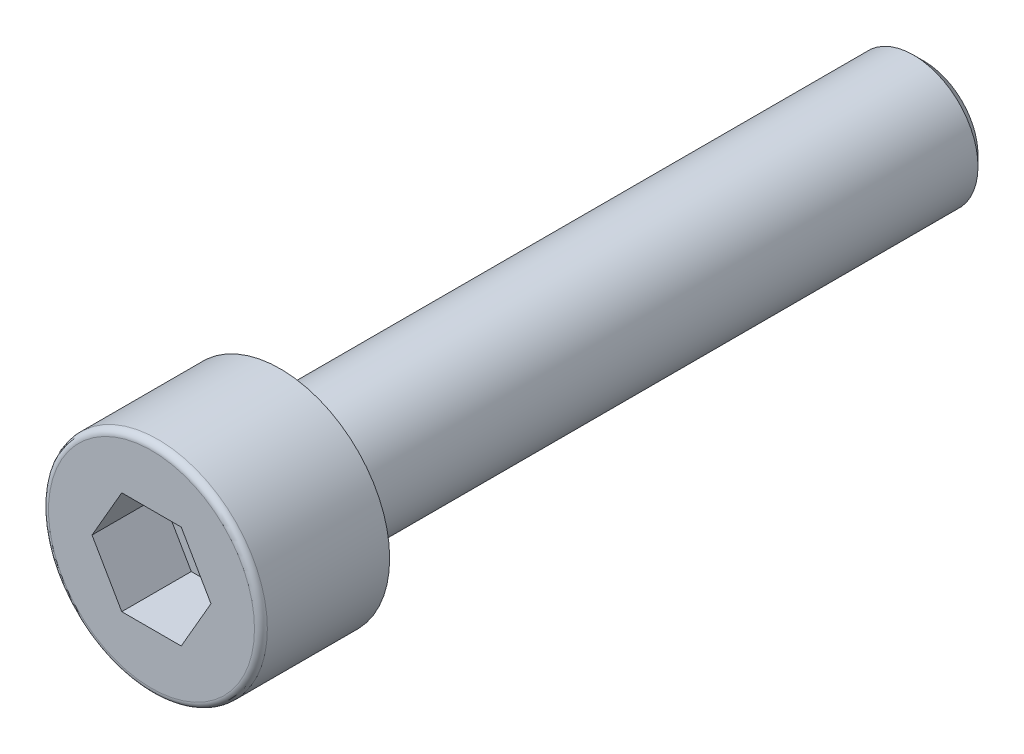
ISO-10303-21;
HEADER;
FILE_DESCRIPTION(('STEP AP214'),'2;1');
FILE_NAME('part.step','',(''),(''),'','','');
FILE_SCHEMA(('AUTOMOTIVE_DESIGN { 1 0 10303 214 1 1 1 1 }'));
ENDSEC;
DATA;
#1=APPLICATION_CONTEXT('core data for automotive mechanical design processes');
#2=APPLICATION_PROTOCOL_DEFINITION('international standard','automotive_design',2000,#1);
#3=PRODUCT_CONTEXT('',#1,'mechanical');
#4=PRODUCT('Part','Part','',(#3));
#5=PRODUCT_RELATED_PRODUCT_CATEGORY('part','',(#4));
#6=PRODUCT_DEFINITION_FORMATION('','',#4);
#7=PRODUCT_DEFINITION_CONTEXT('part definition',#1,'design');
#8=PRODUCT_DEFINITION('design','',#6,#7);
#9=PRODUCT_DEFINITION_SHAPE('','',#8);
#10=(LENGTH_UNIT() NAMED_UNIT(*) SI_UNIT(.MILLI.,.METRE.));
#11=(NAMED_UNIT(*) PLANE_ANGLE_UNIT() SI_UNIT($,.RADIAN.));
#12=(NAMED_UNIT(*) SI_UNIT($,.STERADIAN.) SOLID_ANGLE_UNIT());
#13=UNCERTAINTY_MEASURE_WITH_UNIT(LENGTH_MEASURE(1.E-05),#10,'distance_accuracy_value','');
#14=(GEOMETRIC_REPRESENTATION_CONTEXT(3) GLOBAL_UNCERTAINTY_ASSIGNED_CONTEXT((#13)) GLOBAL_UNIT_ASSIGNED_CONTEXT((#10,
#11,#12)) REPRESENTATION_CONTEXT('',''));
#15=CARTESIAN_POINT('',(0.,0.,0.));
#16=DIRECTION('',(0.,0.,1.));
#17=DIRECTION('',(1.,0.,0.));
#18=AXIS2_PLACEMENT_3D('',#15,#16,#17);
#19=CARTESIAN_POINT('',(0.,0.,-25.));
#20=DIRECTION('',(0.,0.,-1.));
#21=DIRECTION('',(-1.,0.,0.));
#22=AXIS2_PLACEMENT_3D('',#19,#20,#21);
#23=PLANE('',#22);
#24=CARTESIAN_POINT('',(0.,0.,-25.));
#25=DIRECTION('',(0.,0.,-1.));
#26=DIRECTION('',(-1.,0.,0.));
#27=AXIS2_PLACEMENT_3D('',#24,#25,#26);
#28=CIRCLE('',#27,2.1);
#29=CARTESIAN_POINT('',(-2.1,0.,-25.));
#30=VERTEX_POINT('',#29);
#31=EDGE_CURVE('E11',#30,#30,#28,.T.);
#32=ORIENTED_EDGE('',*,*,#31,.T.);
#33=EDGE_LOOP('',(#32));
#34=FACE_BOUND('',#33,.T.);
#35=ADVANCED_FACE('F53',(#34),#23,.T.);
#36=CARTESIAN_POINT('',(0.,0.,5.));
#37=DIRECTION('',(0.,0.,1.));
#38=DIRECTION('',(1.,0.,0.));
#39=AXIS2_PLACEMENT_3D('',#36,#37,#38);
#40=CYLINDRICAL_SURFACE('',#39,2.5);
#41=CARTESIAN_POINT('',(0.,0.,-24.6));
#42=DIRECTION('',(0.,0.,-1.));
#43=DIRECTION('',(-1.,0.,0.));
#44=AXIS2_PLACEMENT_3D('',#41,#42,#43);
#45=CIRCLE('',#44,2.5);
#46=CARTESIAN_POINT('',(-2.49999999999999,0.,-24.6));
#47=VERTEX_POINT('',#46);
#48=EDGE_CURVE('E61',#47,#47,#45,.F.);
#49=ORIENTED_EDGE('',*,*,#48,.T.);
#50=EDGE_LOOP('',(#49));
#51=FACE_BOUND('',#50,.T.);
#52=CARTESIAN_POINT('',(0.,0.,0.));
#53=DIRECTION('',(0.,0.,1.));
#54=DIRECTION('',(1.,0.,0.));
#55=AXIS2_PLACEMENT_3D('',#52,#53,#54);
#56=CIRCLE('',#55,2.5);
#57=CARTESIAN_POINT('',(2.5,0.,0.));
#58=VERTEX_POINT('',#57);
#59=EDGE_CURVE('E169',#58,#58,#56,.T.);
#60=ORIENTED_EDGE('',*,*,#59,.F.);
#61=EDGE_LOOP('',(#60));
#62=FACE_BOUND('',#61,.T.);
#63=ADVANCED_FACE('F174',(#51,#62),#40,.T.);
#64=CARTESIAN_POINT('',(2.5,0.,0.));
#65=DIRECTION('',(0.,0.,-1.));
#66=DIRECTION('',(-1.,0.,0.));
#67=AXIS2_PLACEMENT_3D('',#64,#65,#66);
#68=PLANE('',#67);
#69=ORIENTED_EDGE('',*,*,#59,.T.);
#70=EDGE_LOOP('',(#69));
#71=FACE_BOUND('',#70,.T.);
#72=CARTESIAN_POINT('',(0.,0.,0.));
#73=DIRECTION('',(0.,0.,1.));
#74=DIRECTION('',(1.,0.,0.));
#75=AXIS2_PLACEMENT_3D('',#72,#73,#74);
#76=CIRCLE('',#75,4.25);
#77=CARTESIAN_POINT('',(4.25,0.,0.));
#78=VERTEX_POINT('',#77);
#79=EDGE_CURVE('E166',#78,#78,#76,.T.);
#80=ORIENTED_EDGE('',*,*,#79,.F.);
#81=EDGE_LOOP('',(#80));
#82=FACE_BOUND('',#81,.T.);
#83=ADVANCED_FACE('F192',(#71,#82),#68,.T.);
#84=CARTESIAN_POINT('',(0.,0.,5.));
#85=DIRECTION('',(0.,0.,1.));
#86=DIRECTION('',(1.,0.,0.));
#87=AXIS2_PLACEMENT_3D('',#84,#85,#86);
#88=CYLINDRICAL_SURFACE('',#87,4.25);
#89=ORIENTED_EDGE('',*,*,#79,.T.);
#90=EDGE_LOOP('',(#89));
#91=FACE_BOUND('',#90,.T.);
#92=CARTESIAN_POINT('',(0.,0.,4.75));
#93=DIRECTION('',(0.,0.,1.));
#94=DIRECTION('',(1.,0.,0.));
#95=AXIS2_PLACEMENT_3D('',#92,#93,#94);
#96=CIRCLE('',#95,4.25);
#97=CARTESIAN_POINT('',(4.25,0.,4.75));
#98=VERTEX_POINT('',#97);
#99=EDGE_CURVE('E163',#98,#98,#96,.T.);
#100=ORIENTED_EDGE('',*,*,#99,.F.);
#101=EDGE_LOOP('',(#100));
#102=FACE_BOUND('',#101,.T.);
#103=ADVANCED_FACE('F197',(#91,#102),#88,.T.);
#104=CARTESIAN_POINT('',(0.,0.,4.75));
#105=DIRECTION('',(0.,0.,1.));
#106=DIRECTION('',(1.,0.,0.));
#107=AXIS2_PLACEMENT_3D('',#104,#105,#106);
#108=TOROIDAL_SURFACE('',#107,4.,0.250000000000001);
#109=ORIENTED_EDGE('',*,*,#99,.T.);
#110=EDGE_LOOP('',(#109));
#111=FACE_BOUND('',#110,.T.);
#112=CARTESIAN_POINT('',(0.,0.,5.));
#113=DIRECTION('',(0.,0.,1.));
#114=DIRECTION('',(1.,0.,0.));
#115=AXIS2_PLACEMENT_3D('',#112,#113,#114);
#116=CIRCLE('',#115,4.);
#117=CARTESIAN_POINT('',(4.,0.,5.));
#118=VERTEX_POINT('',#117);
#119=EDGE_CURVE('E155',#118,#118,#116,.T.);
#120=ORIENTED_EDGE('',*,*,#119,.F.);
#121=EDGE_LOOP('',(#120));
#122=FACE_BOUND('',#121,.T.);
#123=ADVANCED_FACE('F201',(#111,#122),#108,.T.);
#124=CARTESIAN_POINT('',(4.,0.,5.));
#125=DIRECTION('',(0.,0.,1.));
#126=DIRECTION('',(1.,0.,0.));
#127=AXIS2_PLACEMENT_3D('',#124,#125,#126);
#128=PLANE('',#127);
#129=DIRECTION('',(0.499999999999999,0.866025403784439,0.));
#130=VECTOR('',#129,1.);
#131=CARTESIAN_POINT('',(1.15470053837925,-2.,5.));
#132=LINE('',#131,#130);
#133=CARTESIAN_POINT('',(1.15470053837925,-2.,5.));
#134=VERTEX_POINT('',#133);
#135=CARTESIAN_POINT('',(2.3094010767585,0.,5.));
#136=VERTEX_POINT('',#135);
#137=EDGE_CURVE('E68',#134,#136,#132,.T.);
#138=ORIENTED_EDGE('',*,*,#137,.F.);
#139=DIRECTION('',(1.,0.,0.));
#140=VECTOR('',#139,1.);
#141=CARTESIAN_POINT('',(-1.15470053837925,-2.,5.));
#142=LINE('',#141,#140);
#143=CARTESIAN_POINT('',(-1.15470053837925,-2.,5.));
#144=VERTEX_POINT('',#143);
#145=EDGE_CURVE('E151',#144,#134,#142,.T.);
#146=ORIENTED_EDGE('',*,*,#145,.F.);
#147=DIRECTION('',(0.5,-0.866025403784438,0.));
#148=VECTOR('',#147,1.);
#149=CARTESIAN_POINT('',(-2.3094010767585,0.,5.));
#150=LINE('',#149,#148);
#151=CARTESIAN_POINT('',(-2.3094010767585,0.,5.));
#152=VERTEX_POINT('',#151);
#153=EDGE_CURVE('E149',#152,#144,#150,.T.);
#154=ORIENTED_EDGE('',*,*,#153,.F.);
#155=DIRECTION('',(-0.499999999999999,-0.866025403784439,0.));
#156=VECTOR('',#155,1.);
#157=CARTESIAN_POINT('',(-1.15470053837925,2.,5.));
#158=LINE('',#157,#156);
#159=CARTESIAN_POINT('',(-1.15470053837925,2.,5.));
#160=VERTEX_POINT('',#159);
#161=EDGE_CURVE('E116',#160,#152,#158,.T.);
#162=ORIENTED_EDGE('',*,*,#161,.F.);
#163=DIRECTION('',(-1.,0.,0.));
#164=VECTOR('',#163,1.);
#165=CARTESIAN_POINT('',(1.15470053837925,2.,5.));
#166=LINE('',#165,#164);
#167=CARTESIAN_POINT('',(1.15470053837925,2.,5.));
#168=VERTEX_POINT('',#167);
#169=EDGE_CURVE('E145',#168,#160,#166,.T.);
#170=ORIENTED_EDGE('',*,*,#169,.F.);
#171=DIRECTION('',(-0.5,0.866025403784438,0.));
#172=VECTOR('',#171,1.);
#173=CARTESIAN_POINT('',(2.3094010767585,0.,5.));
#174=LINE('',#173,#172);
#175=EDGE_CURVE('E142',#136,#168,#174,.T.);
#176=ORIENTED_EDGE('',*,*,#175,.F.);
#177=EDGE_LOOP('',(#138,#146,#154,#162,#170,#176));
#178=FACE_BOUND('',#177,.T.);
#179=ORIENTED_EDGE('',*,*,#119,.T.);
#180=EDGE_LOOP('',(#179));
#181=FACE_BOUND('',#180,.T.);
#182=ADVANCED_FACE('F205',(#178,#181),#128,.T.);
#183=CARTESIAN_POINT('',(1.15470053837925,-2.,2.3));
#184=DIRECTION('',(0.866025403784439,-0.499999999999999,0.));
#185=DIRECTION('',(0.5,0.866025403784439,0.));
#186=AXIS2_PLACEMENT_3D('',#183,#184,#185);
#187=PLANE('',#186);
#188=ORIENTED_EDGE('',*,*,#137,.T.);
#189=DIRECTION('',(0.,0.,1.));
#190=VECTOR('',#189,1.);
#191=CARTESIAN_POINT('',(2.3094010767585,0.,2.3));
#192=LINE('',#191,#190);
#193=CARTESIAN_POINT('',(2.3094010767585,0.,2.3));
#194=VERTEX_POINT('',#193);
#195=EDGE_CURVE('E98',#194,#136,#192,.T.);
#196=ORIENTED_EDGE('',*,*,#195,.F.);
#197=DIRECTION('',(0.499999999999999,0.866025403784439,0.));
#198=VECTOR('',#197,1.);
#199=CARTESIAN_POINT('',(1.15470053837925,-2.,2.3));
#200=LINE('',#199,#198);
#201=CARTESIAN_POINT('',(1.15470053837925,-2.,2.3));
#202=VERTEX_POINT('',#201);
#203=EDGE_CURVE('E153',#202,#194,#200,.T.);
#204=ORIENTED_EDGE('',*,*,#203,.F.);
#205=DIRECTION('',(0.,0.,1.));
#206=VECTOR('',#205,1.);
#207=CARTESIAN_POINT('',(1.15470053837925,-2.,2.3));
#208=LINE('',#207,#206);
#209=EDGE_CURVE('E76',#202,#134,#208,.T.);
#210=ORIENTED_EDGE('',*,*,#209,.T.);
#211=EDGE_LOOP('',(#188,#196,#204,#210));
#212=FACE_BOUND('',#211,.T.);
#213=ADVANCED_FACE('F209',(#212),#187,.F.);
#214=CARTESIAN_POINT('',(-1.15470053837925,-2.,2.3));
#215=DIRECTION('',(0.,-1.,0.));
#216=DIRECTION('',(1.,0.,0.));
#217=AXIS2_PLACEMENT_3D('',#214,#215,#216);
#218=PLANE('',#217);
#219=ORIENTED_EDGE('',*,*,#145,.T.);
#220=ORIENTED_EDGE('',*,*,#209,.F.);
#221=DIRECTION('',(1.,0.,0.));
#222=VECTOR('',#221,1.);
#223=CARTESIAN_POINT('',(-1.15470053837925,-2.,2.3));
#224=LINE('',#223,#222);
#225=CARTESIAN_POINT('',(-1.15470053837925,-2.,2.3));
#226=VERTEX_POINT('',#225);
#227=EDGE_CURVE('E128',#226,#202,#224,.T.);
#228=ORIENTED_EDGE('',*,*,#227,.F.);
#229=DIRECTION('',(0.,0.,1.));
#230=VECTOR('',#229,1.);
#231=CARTESIAN_POINT('',(-1.15470053837925,-2.,2.3));
#232=LINE('',#231,#230);
#233=EDGE_CURVE('E120',#226,#144,#232,.T.);
#234=ORIENTED_EDGE('',*,*,#233,.T.);
#235=EDGE_LOOP('',(#219,#220,#228,#234));
#236=FACE_BOUND('',#235,.T.);
#237=ADVANCED_FACE('F213',(#236),#218,.F.);
#238=CARTESIAN_POINT('',(-2.3094010767585,0.,2.3));
#239=DIRECTION('',(-0.866025403784438,-0.5,0.));
#240=DIRECTION('',(0.5,-0.866025403784439,0.));
#241=AXIS2_PLACEMENT_3D('',#238,#239,#240);
#242=PLANE('',#241);
#243=ORIENTED_EDGE('',*,*,#153,.T.);
#244=ORIENTED_EDGE('',*,*,#233,.F.);
#245=DIRECTION('',(0.5,-0.866025403784438,0.));
#246=VECTOR('',#245,1.);
#247=CARTESIAN_POINT('',(-2.3094010767585,0.,2.3));
#248=LINE('',#247,#246);
#249=CARTESIAN_POINT('',(-2.3094010767585,0.,2.3));
#250=VERTEX_POINT('',#249);
#251=EDGE_CURVE('E124',#250,#226,#248,.T.);
#252=ORIENTED_EDGE('',*,*,#251,.F.);
#253=DIRECTION('',(0.,0.,1.));
#254=VECTOR('',#253,1.);
#255=CARTESIAN_POINT('',(-2.3094010767585,0.,2.3));
#256=LINE('',#255,#254);
#257=EDGE_CURVE('E109',#250,#152,#256,.T.);
#258=ORIENTED_EDGE('',*,*,#257,.T.);
#259=EDGE_LOOP('',(#243,#244,#252,#258));
#260=FACE_BOUND('',#259,.T.);
#261=ADVANCED_FACE('F125',(#260),#242,.F.);
#262=CARTESIAN_POINT('',(-1.15470053837925,2.,2.3));
#263=DIRECTION('',(-0.866025403784439,0.499999999999999,0.));
#264=DIRECTION('',(-0.5,-0.866025403784439,0.));
#265=AXIS2_PLACEMENT_3D('',#262,#263,#264);
#266=PLANE('',#265);
#267=ORIENTED_EDGE('',*,*,#161,.T.);
#268=ORIENTED_EDGE('',*,*,#257,.F.);
#269=DIRECTION('',(-0.499999999999999,-0.866025403784439,0.));
#270=VECTOR('',#269,1.);
#271=CARTESIAN_POINT('',(-1.15470053837925,2.,2.3));
#272=LINE('',#271,#270);
#273=CARTESIAN_POINT('',(-1.15470053837925,2.,2.3));
#274=VERTEX_POINT('',#273);
#275=EDGE_CURVE('E113',#274,#250,#272,.T.);
#276=ORIENTED_EDGE('',*,*,#275,.F.);
#277=DIRECTION('',(0.,0.,1.));
#278=VECTOR('',#277,1.);
#279=CARTESIAN_POINT('',(-1.15470053837925,2.,2.3));
#280=LINE('',#279,#278);
#281=EDGE_CURVE('E121',#274,#160,#280,.T.);
#282=ORIENTED_EDGE('',*,*,#281,.T.);
#283=EDGE_LOOP('',(#267,#268,#276,#282));
#284=FACE_BOUND('',#283,.T.);
#285=ADVANCED_FACE('F111',(#284),#266,.F.);
#286=CARTESIAN_POINT('',(1.15470053837925,2.,2.3));
#287=DIRECTION('',(0.,1.,0.));
#288=DIRECTION('',(0.,0.,1.));
#289=AXIS2_PLACEMENT_3D('',#286,#287,#288);
#290=PLANE('',#289);
#291=ORIENTED_EDGE('',*,*,#169,.T.);
#292=ORIENTED_EDGE('',*,*,#281,.F.);
#293=DIRECTION('',(-1.,0.,0.));
#294=VECTOR('',#293,1.);
#295=CARTESIAN_POINT('',(1.15470053837925,2.,2.3));
#296=LINE('',#295,#294);
#297=CARTESIAN_POINT('',(1.15470053837925,2.,2.3));
#298=VERTEX_POINT('',#297);
#299=EDGE_CURVE('E134',#298,#274,#296,.T.);
#300=ORIENTED_EDGE('',*,*,#299,.F.);
#301=DIRECTION('',(0.,0.,1.));
#302=VECTOR('',#301,1.);
#303=CARTESIAN_POINT('',(1.15470053837925,2.,2.3));
#304=LINE('',#303,#302);
#305=EDGE_CURVE('E158',#298,#168,#304,.T.);
#306=ORIENTED_EDGE('',*,*,#305,.T.);
#307=EDGE_LOOP('',(#291,#292,#300,#306));
#308=FACE_BOUND('',#307,.T.);
#309=ADVANCED_FACE('F216',(#308),#290,.F.);
#310=CARTESIAN_POINT('',(2.3094010767585,0.,2.3));
#311=DIRECTION('',(0.866025403784438,0.5,0.));
#312=DIRECTION('',(-0.5,0.866025403784438,0.));
#313=AXIS2_PLACEMENT_3D('',#310,#311,#312);
#314=PLANE('',#313);
#315=ORIENTED_EDGE('',*,*,#175,.T.);
#316=ORIENTED_EDGE('',*,*,#305,.F.);
#317=DIRECTION('',(-0.5,0.866025403784438,0.));
#318=VECTOR('',#317,1.);
#319=CARTESIAN_POINT('',(2.3094010767585,0.,2.3));
#320=LINE('',#319,#318);
#321=EDGE_CURVE('E136',#194,#298,#320,.T.);
#322=ORIENTED_EDGE('',*,*,#321,.F.);
#323=ORIENTED_EDGE('',*,*,#195,.T.);
#324=EDGE_LOOP('',(#315,#316,#322,#323));
#325=FACE_BOUND('',#324,.T.);
#326=ADVANCED_FACE('F183',(#325),#314,.F.);
#327=CARTESIAN_POINT('',(2.3094010767585,0.,2.3));
#328=DIRECTION('',(0.,0.,1.));
#329=DIRECTION('',(1.,0.,0.));
#330=AXIS2_PLACEMENT_3D('',#327,#328,#329);
#331=PLANE('',#330);
#332=ORIENTED_EDGE('',*,*,#203,.T.);
#333=ORIENTED_EDGE('',*,*,#321,.T.);
#334=ORIENTED_EDGE('',*,*,#299,.T.);
#335=ORIENTED_EDGE('',*,*,#275,.T.);
#336=ORIENTED_EDGE('',*,*,#251,.T.);
#337=ORIENTED_EDGE('',*,*,#227,.T.);
#338=EDGE_LOOP('',(#332,#333,#334,#335,#336,#337));
#339=FACE_BOUND('',#338,.T.);
#340=ADVANCED_FACE('F131',(#339),#331,.T.);
#341=CARTESIAN_POINT('',(0.,0.,-24.6));
#342=DIRECTION('',(0.,0.,1.));
#343=DIRECTION('',(1.,0.,0.));
#344=AXIS2_PLACEMENT_3D('',#341,#342,#343);
#345=CONICAL_SURFACE('',#344,2.5,0.785398163397442);
#346=ORIENTED_EDGE('',*,*,#31,.F.);
#347=EDGE_LOOP('',(#346));
#348=FACE_BOUND('',#347,.T.);
#349=ORIENTED_EDGE('',*,*,#48,.F.);
#350=EDGE_LOOP('',(#349));
#351=FACE_BOUND('',#350,.T.);
#352=ADVANCED_FACE('F55',(#348,#351),#345,.T.);
#353=CLOSED_SHELL('',(#35,#63,#83,#103,#123,#182,#213,#237,#261,#285,#309,#326,#340,#352));
#354=MANIFOLD_SOLID_BREP('B2',#353);
#355=ADVANCED_BREP_SHAPE_REPRESENTATION('',(#18,#354),#14);
#356=SHAPE_DEFINITION_REPRESENTATION(#9,#355);
ENDSEC;
END-ISO-10303-21;
